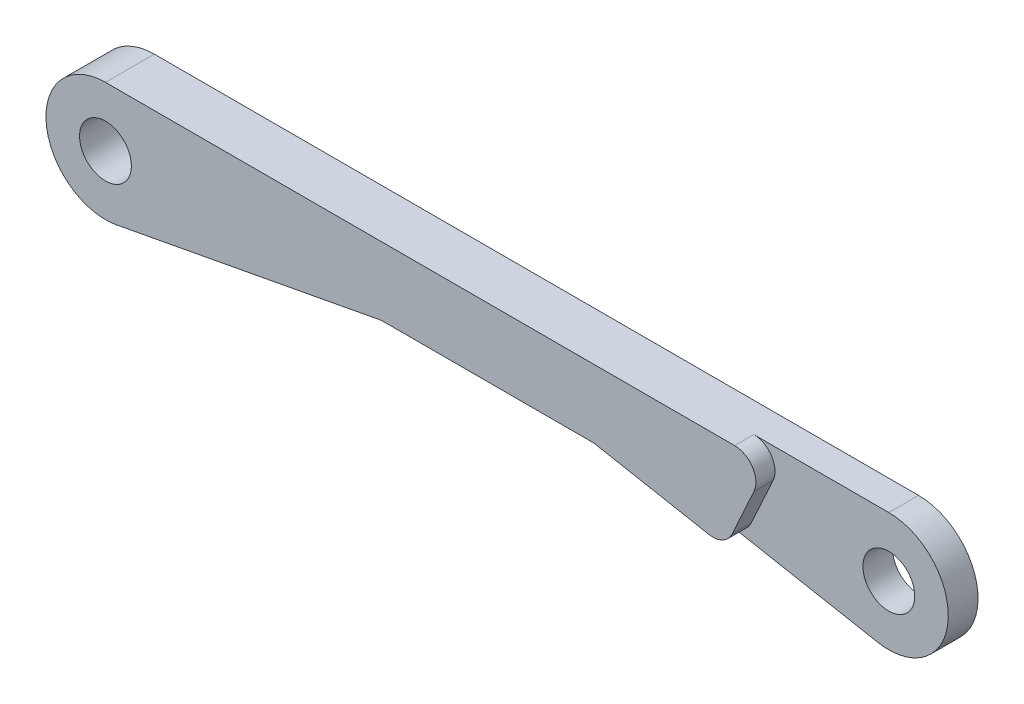
ISO-10303-21;
HEADER;
FILE_DESCRIPTION(('STEP AP214'),'2;1');
FILE_NAME('part.step','',(''),(''),'','','');
FILE_SCHEMA(('AUTOMOTIVE_DESIGN { 1 0 10303 214 1 1 1 1 }'));
ENDSEC;
DATA;
#1=APPLICATION_CONTEXT('core data for automotive mechanical design processes');
#2=APPLICATION_PROTOCOL_DEFINITION('international standard','automotive_design',2000,#1);
#3=PRODUCT_CONTEXT('',#1,'mechanical');
#4=PRODUCT('Part','Part','',(#3));
#5=PRODUCT_RELATED_PRODUCT_CATEGORY('part','',(#4));
#6=PRODUCT_DEFINITION_FORMATION('','',#4);
#7=PRODUCT_DEFINITION_CONTEXT('part definition',#1,'design');
#8=PRODUCT_DEFINITION('design','',#6,#7);
#9=PRODUCT_DEFINITION_SHAPE('','',#8);
#10=(LENGTH_UNIT() NAMED_UNIT(*) SI_UNIT(.MILLI.,.METRE.));
#11=(NAMED_UNIT(*) PLANE_ANGLE_UNIT() SI_UNIT($,.RADIAN.));
#12=(NAMED_UNIT(*) SI_UNIT($,.STERADIAN.) SOLID_ANGLE_UNIT());
#13=UNCERTAINTY_MEASURE_WITH_UNIT(LENGTH_MEASURE(1.E-05),#10,'distance_accuracy_value','');
#14=(GEOMETRIC_REPRESENTATION_CONTEXT(3) GLOBAL_UNCERTAINTY_ASSIGNED_CONTEXT((#13)) GLOBAL_UNIT_ASSIGNED_CONTEXT((#10,
#11,#12)) REPRESENTATION_CONTEXT('',''));
#15=CARTESIAN_POINT('',(0.,0.,0.));
#16=DIRECTION('',(0.,0.,1.));
#17=DIRECTION('',(1.,0.,0.));
#18=AXIS2_PLACEMENT_3D('',#15,#16,#17);
#19=CARTESIAN_POINT('',(-179.89,0.,10.));
#20=DIRECTION('',(0.,0.,-1.));
#21=DIRECTION('',(-1.,0.,0.));
#22=AXIS2_PLACEMENT_3D('',#19,#20,#21);
#23=CYLINDRICAL_SURFACE('',#22,14.);
#24=CARTESIAN_POINT('',(-179.89,0.,11.5));
#25=DIRECTION('',(0.,0.,1.));
#26=DIRECTION('',(1.,0.,0.));
#27=AXIS2_PLACEMENT_3D('',#24,#25,#26);
#28=CIRCLE('',#27,14.);
#29=CARTESIAN_POINT('',(-179.89,14.,11.5));
#30=VERTEX_POINT('',#29);
#31=CARTESIAN_POINT('',(-177.306747694853,-13.7596078260957,11.5));
#32=VERTEX_POINT('',#31);
#33=EDGE_CURVE('E148',#30,#32,#28,.T.);
#34=ORIENTED_EDGE('',*,*,#33,.F.);
#35=DIRECTION('',(0.,0.,-1.));
#36=VECTOR('',#35,1.);
#37=CARTESIAN_POINT('',(-179.89,14.,10.));
#38=LINE('',#37,#36);
#39=CARTESIAN_POINT('',(-179.89,14.,0.));
#40=VERTEX_POINT('',#39);
#41=EDGE_CURVE('E216',#30,#40,#38,.T.);
#42=ORIENTED_EDGE('',*,*,#41,.T.);
#43=CARTESIAN_POINT('',(-179.89,0.,0.));
#44=DIRECTION('',(0.,0.,1.));
#45=DIRECTION('',(1.,0.,0.));
#46=AXIS2_PLACEMENT_3D('',#43,#44,#45);
#47=CIRCLE('',#46,14.);
#48=CARTESIAN_POINT('',(-177.306747694853,-13.7596078260957,0.));
#49=VERTEX_POINT('',#48);
#50=EDGE_CURVE('E199',#40,#49,#47,.T.);
#51=ORIENTED_EDGE('',*,*,#50,.T.);
#52=DIRECTION('',(0.,0.,-1.));
#53=VECTOR('',#52,1.);
#54=CARTESIAN_POINT('',(-177.306747694853,-13.7596078260957,10.));
#55=LINE('',#54,#53);
#56=EDGE_CURVE('E213',#32,#49,#55,.T.);
#57=ORIENTED_EDGE('',*,*,#56,.F.);
#58=EDGE_LOOP('',(#34,#42,#51,#57));
#59=FACE_BOUND('',#58,.T.);
#60=ADVANCED_FACE('F49',(#59),#23,.T.);
#61=CARTESIAN_POINT('',(-179.89,0.,10.));
#62=DIRECTION('',(0.,0.,-1.));
#63=DIRECTION('',(-1.,0.,0.));
#64=AXIS2_PLACEMENT_3D('',#61,#62,#63);
#65=CYLINDRICAL_SURFACE('',#64,6.09999999999998);
#66=CARTESIAN_POINT('',(-179.89,0.,0.));
#67=DIRECTION('',(0.,0.,1.));
#68=DIRECTION('',(1.,0.,0.));
#69=AXIS2_PLACEMENT_3D('',#66,#67,#68);
#70=CIRCLE('',#69,6.09999999999998);
#71=CARTESIAN_POINT('',(-173.79,0.,0.));
#72=VERTEX_POINT('',#71);
#73=EDGE_CURVE('E209',#72,#72,#70,.T.);
#74=ORIENTED_EDGE('',*,*,#73,.F.);
#75=EDGE_LOOP('',(#74));
#76=FACE_BOUND('',#75,.T.);
#77=CARTESIAN_POINT('',(-179.89,0.,11.5));
#78=DIRECTION('',(0.,0.,1.));
#79=DIRECTION('',(1.,0.,0.));
#80=AXIS2_PLACEMENT_3D('',#77,#78,#79);
#81=CIRCLE('',#80,6.09999999999998);
#82=CARTESIAN_POINT('',(-173.79,0.,11.5));
#83=VERTEX_POINT('',#82);
#84=EDGE_CURVE('E169',#83,#83,#81,.T.);
#85=ORIENTED_EDGE('',*,*,#84,.T.);
#86=EDGE_LOOP('',(#85));
#87=FACE_BOUND('',#86,.T.);
#88=ADVANCED_FACE('F286',(#76,#87),#65,.F.);
#89=CARTESIAN_POINT('',(-2.58325230514667,-13.7596078260957,10.));
#90=DIRECTION('',(0.18451802179619,0.982829130435408,0.));
#91=DIRECTION('',(-0.982829130435408,0.18451802179619,0.));
#92=AXIS2_PLACEMENT_3D('',#89,#90,#91);
#93=PLANE('',#92);
#94=DIRECTION('',(0.982829130435408,-0.18451802179619,0.));
#95=VECTOR('',#94,1.);
#96=CARTESIAN_POINT('',(-2.58325230514667,-13.7596078260957,7.));
#97=LINE('',#96,#95);
#98=CARTESIAN_POINT('',(-37.8429686642884,-7.139888375166,7.));
#99=VERTEX_POINT('',#98);
#100=CARTESIAN_POINT('',(-2.58325230514667,-13.7596078260957,7.));
#101=VERTEX_POINT('',#100);
#102=EDGE_CURVE('E176',#99,#101,#97,.T.);
#103=ORIENTED_EDGE('',*,*,#102,.F.);
#104=DIRECTION('',(0.,0.,-1.));
#105=VECTOR('',#104,1.);
#106=CARTESIAN_POINT('',(-37.8429686642884,-7.139888375166,11.5));
#107=LINE('',#106,#105);
#108=CARTESIAN_POINT('',(-37.8429686642884,-7.139888375166,11.5));
#109=VERTEX_POINT('',#108);
#110=EDGE_CURVE('E233',#99,#109,#107,.F.);
#111=ORIENTED_EDGE('',*,*,#110,.T.);
#112=DIRECTION('',(0.982829130435408,-0.18451802179619,0.));
#113=VECTOR('',#112,1.);
#114=CARTESIAN_POINT('',(-2.58325230514667,-13.7596078260957,11.5));
#115=LINE('',#114,#113);
#116=CARTESIAN_POINT('',(-64.9449999999999,-2.05170666192311,11.5));
#117=VERTEX_POINT('',#116);
#118=EDGE_CURVE('E155',#117,#109,#115,.T.);
#119=ORIENTED_EDGE('',*,*,#118,.F.);
#120=DIRECTION('',(0.,0.,1.));
#121=VECTOR('',#120,1.);
#122=CARTESIAN_POINT('',(-64.9449999999999,-2.05170666192312,0.));
#123=LINE('',#122,#121);
#124=CARTESIAN_POINT('',(-64.9449999999999,-2.05170666192312,0.));
#125=VERTEX_POINT('',#124);
#126=EDGE_CURVE('E137',#125,#117,#123,.T.);
#127=ORIENTED_EDGE('',*,*,#126,.F.);
#128=DIRECTION('',(0.982829130435408,-0.18451802179619,0.));
#129=VECTOR('',#128,1.);
#130=CARTESIAN_POINT('',(-2.58325230514667,-13.7596078260957,0.));
#131=LINE('',#130,#129);
#132=CARTESIAN_POINT('',(-2.58325230514667,-13.7596078260957,0.));
#133=VERTEX_POINT('',#132);
#134=EDGE_CURVE('E188',#125,#133,#131,.T.);
#135=ORIENTED_EDGE('',*,*,#134,.T.);
#136=DIRECTION('',(0.,0.,-1.));
#137=VECTOR('',#136,1.);
#138=CARTESIAN_POINT('',(-2.58325230514667,-13.7596078260957,10.));
#139=LINE('',#138,#137);
#140=EDGE_CURVE('E222',#101,#133,#139,.T.);
#141=ORIENTED_EDGE('',*,*,#140,.F.);
#142=EDGE_LOOP('',(#103,#111,#119,#127,#135,#141));
#143=FACE_BOUND('',#142,.T.);
#144=ADVANCED_FACE('F256',(#143),#93,.F.);
#145=CARTESIAN_POINT('',(0.,0.,10.));
#146=DIRECTION('',(0.,0.,-1.));
#147=DIRECTION('',(-1.,0.,0.));
#148=AXIS2_PLACEMENT_3D('',#145,#146,#147);
#149=CYLINDRICAL_SURFACE('',#148,14.);
#150=CARTESIAN_POINT('',(0.,0.,7.));
#151=DIRECTION('',(0.,0.,1.));
#152=DIRECTION('',(1.,0.,0.));
#153=AXIS2_PLACEMENT_3D('',#150,#151,#152);
#154=CIRCLE('',#153,14.);
#155=CARTESIAN_POINT('',(0.,14.,7.));
#156=VERTEX_POINT('',#155);
#157=EDGE_CURVE('E179',#101,#156,#154,.T.);
#158=ORIENTED_EDGE('',*,*,#157,.F.);
#159=ORIENTED_EDGE('',*,*,#140,.T.);
#160=CARTESIAN_POINT('',(0.,0.,0.));
#161=DIRECTION('',(0.,0.,1.));
#162=DIRECTION('',(1.,0.,0.));
#163=AXIS2_PLACEMENT_3D('',#160,#161,#162);
#164=CIRCLE('',#163,14.);
#165=CARTESIAN_POINT('',(0.,14.,0.));
#166=VERTEX_POINT('',#165);
#167=EDGE_CURVE('E191',#133,#166,#164,.T.);
#168=ORIENTED_EDGE('',*,*,#167,.T.);
#169=DIRECTION('',(0.,0.,-1.));
#170=VECTOR('',#169,1.);
#171=CARTESIAN_POINT('',(0.,14.,10.));
#172=LINE('',#171,#170);
#173=EDGE_CURVE('E219',#156,#166,#172,.T.);
#174=ORIENTED_EDGE('',*,*,#173,.F.);
#175=EDGE_LOOP('',(#158,#159,#168,#174));
#176=FACE_BOUND('',#175,.T.);
#177=ADVANCED_FACE('F278',(#176),#149,.T.);
#178=CARTESIAN_POINT('',(0.,14.,10.));
#179=DIRECTION('',(0.,1.,0.));
#180=DIRECTION('',(-1.,0.,0.));
#181=AXIS2_PLACEMENT_3D('',#178,#179,#180);
#182=PLANE('',#181);
#183=DIRECTION('',(-1.,0.,0.));
#184=VECTOR('',#183,1.);
#185=CARTESIAN_POINT('',(0.,14.,11.5));
#186=LINE('',#185,#184);
#187=CARTESIAN_POINT('',(-31.7854118408189,14.,11.5));
#188=VERTEX_POINT('',#187);
#189=EDGE_CURVE('E150',#188,#30,#186,.T.);
#190=ORIENTED_EDGE('',*,*,#189,.F.);
#191=DIRECTION('',(0.,0.,-1.));
#192=VECTOR('',#191,1.);
#193=CARTESIAN_POINT('',(-31.7854118408189,14.,10.));
#194=LINE('',#193,#192);
#195=CARTESIAN_POINT('',(-31.7854118408189,14.,7.));
#196=VERTEX_POINT('',#195);
#197=EDGE_CURVE('E241',#188,#196,#194,.T.);
#198=ORIENTED_EDGE('',*,*,#197,.T.);
#199=DIRECTION('',(-1.,0.,0.));
#200=VECTOR('',#199,1.);
#201=CARTESIAN_POINT('',(0.,14.,7.));
#202=LINE('',#201,#200);
#203=EDGE_CURVE('E64',#156,#196,#202,.T.);
#204=ORIENTED_EDGE('',*,*,#203,.F.);
#205=ORIENTED_EDGE('',*,*,#173,.T.);
#206=DIRECTION('',(1.,0.,0.));
#207=VECTOR('',#206,1.);
#208=CARTESIAN_POINT('',(0.,14.,0.));
#209=LINE('',#208,#207);
#210=EDGE_CURVE('E195',#40,#166,#209,.T.);
#211=ORIENTED_EDGE('',*,*,#210,.F.);
#212=ORIENTED_EDGE('',*,*,#41,.F.);
#213=EDGE_LOOP('',(#190,#198,#204,#205,#211,#212));
#214=FACE_BOUND('',#213,.T.);
#215=ADVANCED_FACE('F269',(#214),#182,.T.);
#216=CARTESIAN_POINT('',(-3.54144460197718,18.863387352434,10.));
#217=DIRECTION('',(-0.18451802179619,0.982829130435408,0.));
#218=DIRECTION('',(-0.982829130435408,-0.18451802179619,0.));
#219=AXIS2_PLACEMENT_3D('',#216,#217,#218);
#220=PLANE('',#219);
#221=DIRECTION('',(0.982829130435408,0.18451802179619,0.));
#222=VECTOR('',#221,1.);
#223=CARTESIAN_POINT('',(-3.54144460197718,18.863387352434,0.));
#224=LINE('',#223,#222);
#225=CARTESIAN_POINT('',(-114.945,-2.05170666192311,0.));
#226=VERTEX_POINT('',#225);
#227=EDGE_CURVE('E132',#49,#226,#224,.T.);
#228=ORIENTED_EDGE('',*,*,#227,.T.);
#229=DIRECTION('',(0.,0.,1.));
#230=VECTOR('',#229,1.);
#231=CARTESIAN_POINT('',(-114.945,-2.05170666192311,0.));
#232=LINE('',#231,#230);
#233=CARTESIAN_POINT('',(-114.945,-2.05170666192311,11.5));
#234=VERTEX_POINT('',#233);
#235=EDGE_CURVE('E127',#226,#234,#232,.T.);
#236=ORIENTED_EDGE('',*,*,#235,.T.);
#237=DIRECTION('',(0.982829130435408,0.18451802179619,0.));
#238=VECTOR('',#237,1.);
#239=CARTESIAN_POINT('',(-3.54144460197717,18.863387352434,11.5));
#240=LINE('',#239,#238);
#241=EDGE_CURVE('E130',#32,#234,#240,.T.);
#242=ORIENTED_EDGE('',*,*,#241,.F.);
#243=ORIENTED_EDGE('',*,*,#56,.T.);
#244=EDGE_LOOP('',(#228,#236,#242,#243));
#245=FACE_BOUND('',#244,.T.);
#246=ADVANCED_FACE('F129',(#245),#220,.F.);
#247=CARTESIAN_POINT('',(0.,0.,10.));
#248=DIRECTION('',(0.,0.,-1.));
#249=DIRECTION('',(-1.,0.,0.));
#250=AXIS2_PLACEMENT_3D('',#247,#248,#249);
#251=CYLINDRICAL_SURFACE('',#250,6.1);
#252=CARTESIAN_POINT('',(0.,0.,0.));
#253=DIRECTION('',(0.,0.,1.));
#254=DIRECTION('',(1.,0.,0.));
#255=AXIS2_PLACEMENT_3D('',#252,#253,#254);
#256=CIRCLE('',#255,6.1);
#257=CARTESIAN_POINT('',(6.1,0.,0.));
#258=VERTEX_POINT('',#257);
#259=EDGE_CURVE('E205',#258,#258,#256,.T.);
#260=ORIENTED_EDGE('',*,*,#259,.F.);
#261=EDGE_LOOP('',(#260));
#262=FACE_BOUND('',#261,.T.);
#263=CARTESIAN_POINT('',(0.,0.,7.));
#264=DIRECTION('',(0.,0.,1.));
#265=DIRECTION('',(1.,0.,0.));
#266=AXIS2_PLACEMENT_3D('',#263,#264,#265);
#267=CIRCLE('',#266,6.1);
#268=CARTESIAN_POINT('',(6.1,0.,7.));
#269=VERTEX_POINT('',#268);
#270=EDGE_CURVE('E184',#269,#269,#267,.F.);
#271=ORIENTED_EDGE('',*,*,#270,.F.);
#272=EDGE_LOOP('',(#271));
#273=FACE_BOUND('',#272,.T.);
#274=ADVANCED_FACE('F320',(#262,#273),#251,.F.);
#275=CARTESIAN_POINT('',(0.,0.,0.));
#276=DIRECTION('',(0.,0.,1.));
#277=DIRECTION('',(1.,0.,0.));
#278=AXIS2_PLACEMENT_3D('',#275,#276,#277);
#279=PLANE('',#278);
#280=ORIENTED_EDGE('',*,*,#134,.F.);
#281=DIRECTION('',(1.,0.,0.));
#282=VECTOR('',#281,1.);
#283=CARTESIAN_POINT('',(0.,-2.05170666192313,0.));
#284=LINE('',#283,#282);
#285=EDGE_CURVE('E138',#226,#125,#284,.T.);
#286=ORIENTED_EDGE('',*,*,#285,.F.);
#287=ORIENTED_EDGE('',*,*,#227,.F.);
#288=ORIENTED_EDGE('',*,*,#50,.F.);
#289=ORIENTED_EDGE('',*,*,#210,.T.);
#290=ORIENTED_EDGE('',*,*,#167,.F.);
#291=EDGE_LOOP('',(#280,#286,#287,#288,#289,#290));
#292=FACE_BOUND('',#291,.T.);
#293=ORIENTED_EDGE('',*,*,#259,.T.);
#294=EDGE_LOOP('',(#293));
#295=FACE_BOUND('',#294,.T.);
#296=ORIENTED_EDGE('',*,*,#73,.T.);
#297=EDGE_LOOP('',(#296));
#298=FACE_BOUND('',#297,.T.);
#299=ADVANCED_FACE('F274',(#292,#295,#298),#279,.F.);
#300=CARTESIAN_POINT('',(0.,0.,7.));
#301=DIRECTION('',(0.,0.,1.));
#302=DIRECTION('',(1.,0.,0.));
#303=AXIS2_PLACEMENT_3D('',#300,#301,#302);
#304=PLANE('',#303);
#305=ORIENTED_EDGE('',*,*,#203,.T.);
#306=CARTESIAN_POINT('',(-31.7854118408189,9.00000000000002,7.));
#307=DIRECTION('',(0.,0.,1.));
#308=DIRECTION('',(1.,0.,0.));
#309=AXIS2_PLACEMENT_3D('',#306,#307,#308);
#310=CIRCLE('',#309,5.);
#311=CARTESIAN_POINT('',(-27.2385294731398,6.92012963517216,7.));
#312=VERTEX_POINT('',#311);
#313=EDGE_CURVE('E11',#196,#312,#310,.F.);
#314=ORIENTED_EDGE('',*,*,#313,.T.);
#315=DIRECTION('',(-0.415974072965572,-0.909376473535814,0.));
#316=VECTOR('',#315,1.);
#317=CARTESIAN_POINT('',(-25.1430521926711,11.5011308646522,7.));
#318=LINE('',#317,#316);
#319=CARTESIAN_POINT('',(-32.3734961876284,-4.30561308781682,7.));
#320=VERTEX_POINT('',#319);
#321=EDGE_CURVE('E161',#312,#320,#318,.T.);
#322=ORIENTED_EDGE('',*,*,#321,.T.);
#323=CARTESIAN_POINT('',(-36.9203785553074,-2.22574272298896,7.));
#324=DIRECTION('',(0.,0.,1.));
#325=DIRECTION('',(1.,0.,0.));
#326=AXIS2_PLACEMENT_3D('',#323,#324,#325);
#327=CIRCLE('',#326,5.);
#328=EDGE_CURVE('E58',#320,#99,#327,.F.);
#329=ORIENTED_EDGE('',*,*,#328,.T.);
#330=ORIENTED_EDGE('',*,*,#102,.T.);
#331=ORIENTED_EDGE('',*,*,#157,.T.);
#332=EDGE_LOOP('',(#305,#314,#322,#329,#330,#331));
#333=FACE_BOUND('',#332,.T.);
#334=ORIENTED_EDGE('',*,*,#270,.T.);
#335=EDGE_LOOP('',(#334));
#336=FACE_BOUND('',#335,.T.);
#337=ADVANCED_FACE('F247',(#333,#336),#304,.T.);
#338=CARTESIAN_POINT('',(-179.89,0.,11.5));
#339=DIRECTION('',(0.,0.,1.));
#340=DIRECTION('',(1.,0.,0.));
#341=AXIS2_PLACEMENT_3D('',#338,#339,#340);
#342=PLANE('',#341);
#343=ORIENTED_EDGE('',*,*,#118,.T.);
#344=CARTESIAN_POINT('',(-36.9203785553074,-2.22574272298896,11.5));
#345=DIRECTION('',(0.,0.,1.));
#346=DIRECTION('',(1.,0.,0.));
#347=AXIS2_PLACEMENT_3D('',#344,#345,#346);
#348=CIRCLE('',#347,5.);
#349=CARTESIAN_POINT('',(-32.3734961876284,-4.30561308781682,11.5));
#350=VERTEX_POINT('',#349);
#351=EDGE_CURVE('E238',#109,#350,#348,.T.);
#352=ORIENTED_EDGE('',*,*,#351,.T.);
#353=DIRECTION('',(-0.415974072965572,-0.909376473535814,0.));
#354=VECTOR('',#353,1.);
#355=CARTESIAN_POINT('',(-25.1430521926711,11.5011308646522,11.5));
#356=LINE('',#355,#354);
#357=CARTESIAN_POINT('',(-27.2385294731398,6.92012963517216,11.5));
#358=VERTEX_POINT('',#357);
#359=EDGE_CURVE('E165',#358,#350,#356,.T.);
#360=ORIENTED_EDGE('',*,*,#359,.F.);
#361=CARTESIAN_POINT('',(-31.7854118408189,9.00000000000002,11.5));
#362=DIRECTION('',(0.,0.,1.));
#363=DIRECTION('',(1.,0.,0.));
#364=AXIS2_PLACEMENT_3D('',#361,#362,#363);
#365=CIRCLE('',#364,5.);
#366=EDGE_CURVE('E72',#358,#188,#365,.T.);
#367=ORIENTED_EDGE('',*,*,#366,.T.);
#368=ORIENTED_EDGE('',*,*,#189,.T.);
#369=ORIENTED_EDGE('',*,*,#33,.T.);
#370=ORIENTED_EDGE('',*,*,#241,.T.);
#371=DIRECTION('',(1.,0.,0.));
#372=VECTOR('',#371,1.);
#373=CARTESIAN_POINT('',(0.,-2.05170666192313,11.5));
#374=LINE('',#373,#372);
#375=EDGE_CURVE('E145',#234,#117,#374,.T.);
#376=ORIENTED_EDGE('',*,*,#375,.T.);
#377=EDGE_LOOP('',(#343,#352,#360,#367,#368,#369,#370,#376));
#378=FACE_BOUND('',#377,.T.);
#379=ORIENTED_EDGE('',*,*,#84,.F.);
#380=EDGE_LOOP('',(#379));
#381=FACE_BOUND('',#380,.T.);
#382=ADVANCED_FACE('F143',(#378,#381),#342,.T.);
#383=CARTESIAN_POINT('',(0.,-2.05170666192313,0.));
#384=DIRECTION('',(0.,-1.,0.));
#385=DIRECTION('',(1.,0.,0.));
#386=AXIS2_PLACEMENT_3D('',#383,#384,#385);
#387=PLANE('',#386);
#388=ORIENTED_EDGE('',*,*,#126,.T.);
#389=ORIENTED_EDGE('',*,*,#375,.F.);
#390=ORIENTED_EDGE('',*,*,#235,.F.);
#391=ORIENTED_EDGE('',*,*,#285,.T.);
#392=EDGE_LOOP('',(#388,#389,#390,#391));
#393=FACE_BOUND('',#392,.T.);
#394=ADVANCED_FACE('F152',(#393),#387,.T.);
#395=CARTESIAN_POINT('',(-25.1430521926711,11.5011308646522,11.5));
#396=DIRECTION('',(0.909376473535814,-0.415974072965572,0.));
#397=DIRECTION('',(0.415974072965572,0.909376473535814,0.));
#398=AXIS2_PLACEMENT_3D('',#395,#396,#397);
#399=PLANE('',#398);
#400=ORIENTED_EDGE('',*,*,#359,.T.);
#401=DIRECTION('',(0.,0.,-1.));
#402=VECTOR('',#401,1.);
#403=CARTESIAN_POINT('',(-32.3734961876284,-4.30561308781682,7.));
#404=LINE('',#403,#402);
#405=EDGE_CURVE('E229',#350,#320,#404,.T.);
#406=ORIENTED_EDGE('',*,*,#405,.T.);
#407=ORIENTED_EDGE('',*,*,#321,.F.);
#408=DIRECTION('',(0.,0.,-1.));
#409=VECTOR('',#408,1.);
#410=CARTESIAN_POINT('',(-27.2385294731398,6.92012963517216,11.5));
#411=LINE('',#410,#409);
#412=EDGE_CURVE('E226',#312,#358,#411,.F.);
#413=ORIENTED_EDGE('',*,*,#412,.T.);
#414=EDGE_LOOP('',(#400,#406,#407,#413));
#415=FACE_BOUND('',#414,.T.);
#416=ADVANCED_FACE('F260',(#415),#399,.T.);
#417=CARTESIAN_POINT('',(-36.9203785553074,-2.22574272298896,11.5));
#418=DIRECTION('',(0.,0.,1.));
#419=DIRECTION('',(1.,0.,0.));
#420=AXIS2_PLACEMENT_3D('',#417,#418,#419);
#421=CYLINDRICAL_SURFACE('',#420,5.);
#422=ORIENTED_EDGE('',*,*,#351,.F.);
#423=ORIENTED_EDGE('',*,*,#110,.F.);
#424=ORIENTED_EDGE('',*,*,#328,.F.);
#425=ORIENTED_EDGE('',*,*,#405,.F.);
#426=EDGE_LOOP('',(#422,#423,#424,#425));
#427=FACE_BOUND('',#426,.T.);
#428=ADVANCED_FACE('F254',(#427),#421,.T.);
#429=CARTESIAN_POINT('',(-31.7854118408189,9.00000000000002,10.));
#430=DIRECTION('',(0.,0.,-1.));
#431=DIRECTION('',(-1.,0.,0.));
#432=AXIS2_PLACEMENT_3D('',#429,#430,#431);
#433=CYLINDRICAL_SURFACE('',#432,5.);
#434=ORIENTED_EDGE('',*,*,#366,.F.);
#435=ORIENTED_EDGE('',*,*,#412,.F.);
#436=ORIENTED_EDGE('',*,*,#313,.F.);
#437=ORIENTED_EDGE('',*,*,#197,.F.);
#438=EDGE_LOOP('',(#434,#435,#436,#437));
#439=FACE_BOUND('',#438,.T.);
#440=ADVANCED_FACE('F51',(#439),#433,.T.);
#441=CLOSED_SHELL('',(#60,#88,#144,#177,#215,#246,#274,#299,#337,#382,#394,#416,#428,#440));
#442=MANIFOLD_SOLID_BREP('B2',#441);
#443=ADVANCED_BREP_SHAPE_REPRESENTATION('',(#18,#442),#14);
#444=SHAPE_DEFINITION_REPRESENTATION(#9,#443);
ENDSEC;
END-ISO-10303-21;
